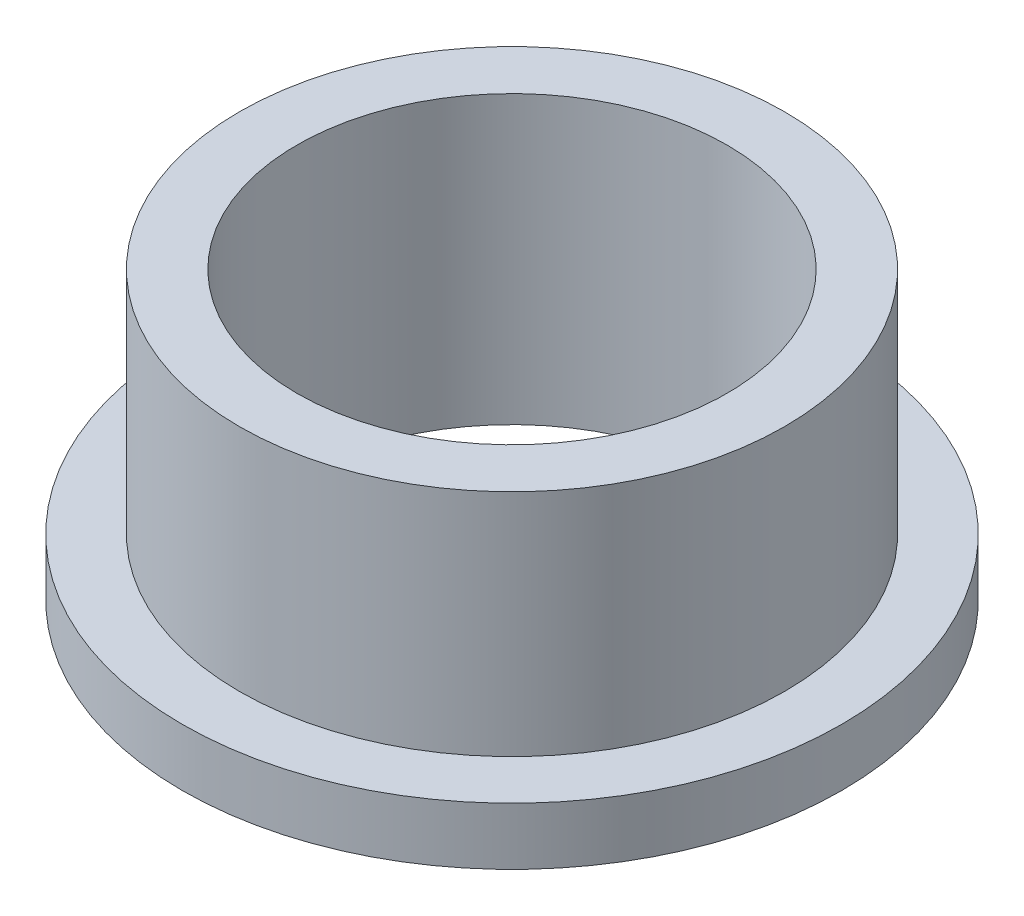
ISO-10303-21;
HEADER;
FILE_DESCRIPTION(('STEP AP214'),'2;1');
FILE_NAME('part.step','',(''),(''),'','','');
FILE_SCHEMA(('AUTOMOTIVE_DESIGN { 1 0 10303 214 1 1 1 1 }'));
ENDSEC;
DATA;
#1=APPLICATION_CONTEXT('core data for automotive mechanical design processes');
#2=APPLICATION_PROTOCOL_DEFINITION('international standard','automotive_design',2000,#1);
#3=PRODUCT_CONTEXT('',#1,'mechanical');
#4=PRODUCT('Part','Part','',(#3));
#5=PRODUCT_RELATED_PRODUCT_CATEGORY('part','',(#4));
#6=PRODUCT_DEFINITION_FORMATION('','',#4);
#7=PRODUCT_DEFINITION_CONTEXT('part definition',#1,'design');
#8=PRODUCT_DEFINITION('design','',#6,#7);
#9=PRODUCT_DEFINITION_SHAPE('','',#8);
#10=(LENGTH_UNIT() NAMED_UNIT(*) SI_UNIT(.MILLI.,.METRE.));
#11=(NAMED_UNIT(*) PLANE_ANGLE_UNIT() SI_UNIT($,.RADIAN.));
#12=(NAMED_UNIT(*) SI_UNIT($,.STERADIAN.) SOLID_ANGLE_UNIT());
#13=UNCERTAINTY_MEASURE_WITH_UNIT(LENGTH_MEASURE(1.E-05),#10,'distance_accuracy_value','');
#14=(GEOMETRIC_REPRESENTATION_CONTEXT(3) GLOBAL_UNCERTAINTY_ASSIGNED_CONTEXT((#13)) GLOBAL_UNIT_ASSIGNED_CONTEXT((#10,
#11,#12)) REPRESENTATION_CONTEXT('',''));
#15=CARTESIAN_POINT('',(0.,0.,0.));
#16=DIRECTION('',(0.,0.,1.));
#17=DIRECTION('',(1.,0.,0.));
#18=AXIS2_PLACEMENT_3D('',#15,#16,#17);
#19=CARTESIAN_POINT('',(0.,20.,0.));
#20=DIRECTION('',(0.,1.,0.));
#21=DIRECTION('',(0.,0.,1.));
#22=AXIS2_PLACEMENT_3D('',#19,#20,#21);
#23=PLANE('',#22);
#24=CARTESIAN_POINT('',(0.,20.,0.));
#25=DIRECTION('',(0.,1.,0.));
#26=DIRECTION('',(0.,0.,1.));
#27=AXIS2_PLACEMENT_3D('',#24,#25,#26);
#28=CIRCLE('',#27,19.02);
#29=CARTESIAN_POINT('',(0.,20.,19.02));
#30=VERTEX_POINT('',#29);
#31=EDGE_CURVE('E10',#30,#30,#28,.T.);
#32=ORIENTED_EDGE('',*,*,#31,.T.);
#33=EDGE_LOOP('',(#32));
#34=FACE_BOUND('',#33,.T.);
#35=CARTESIAN_POINT('',(0.,20.,0.));
#36=DIRECTION('',(0.,1.,0.));
#37=DIRECTION('',(0.,0.,1.));
#38=AXIS2_PLACEMENT_3D('',#35,#36,#37);
#39=CIRCLE('',#38,15.005);
#40=CARTESIAN_POINT('',(0.,20.,15.005));
#41=VERTEX_POINT('',#40);
#42=EDGE_CURVE('E38',#41,#41,#39,.T.);
#43=ORIENTED_EDGE('',*,*,#42,.F.);
#44=EDGE_LOOP('',(#43));
#45=FACE_BOUND('',#44,.T.);
#46=ADVANCED_FACE('F31',(#34,#45),#23,.T.);
#47=CARTESIAN_POINT('',(0.,0.,0.));
#48=DIRECTION('',(0.,1.,0.));
#49=DIRECTION('',(0.,0.,1.));
#50=AXIS2_PLACEMENT_3D('',#47,#48,#49);
#51=PLANE('',#50);
#52=CARTESIAN_POINT('',(0.,0.,0.));
#53=DIRECTION('',(0.,1.,0.));
#54=DIRECTION('',(0.,0.,1.));
#55=AXIS2_PLACEMENT_3D('',#52,#53,#54);
#56=CIRCLE('',#55,15.005);
#57=CARTESIAN_POINT('',(0.,0.,15.005));
#58=VERTEX_POINT('',#57);
#59=EDGE_CURVE('E42',#58,#58,#56,.T.);
#60=ORIENTED_EDGE('',*,*,#59,.T.);
#61=EDGE_LOOP('',(#60));
#62=FACE_BOUND('',#61,.T.);
#63=CARTESIAN_POINT('',(0.,0.,0.));
#64=DIRECTION('',(0.,1.,0.));
#65=DIRECTION('',(0.,0.,1.));
#66=AXIS2_PLACEMENT_3D('',#63,#64,#65);
#67=CIRCLE('',#66,23.);
#68=CARTESIAN_POINT('',(0.,0.,23.));
#69=VERTEX_POINT('',#68);
#70=EDGE_CURVE('E49',#69,#69,#67,.T.);
#71=ORIENTED_EDGE('',*,*,#70,.F.);
#72=EDGE_LOOP('',(#71));
#73=FACE_BOUND('',#72,.T.);
#74=ADVANCED_FACE('F74',(#62,#73),#51,.F.);
#75=CARTESIAN_POINT('',(0.,20.,0.));
#76=DIRECTION('',(0.,-1.,0.));
#77=DIRECTION('',(0.,0.,-1.));
#78=AXIS2_PLACEMENT_3D('',#75,#76,#77);
#79=CYLINDRICAL_SURFACE('',#78,19.02);
#80=CARTESIAN_POINT('',(0.,4.,0.));
#81=DIRECTION('',(0.,1.,0.));
#82=DIRECTION('',(0.,0.,1.));
#83=AXIS2_PLACEMENT_3D('',#80,#81,#82);
#84=CIRCLE('',#83,19.02);
#85=CARTESIAN_POINT('',(0.,4.,19.02));
#86=VERTEX_POINT('',#85);
#87=EDGE_CURVE('E52',#86,#86,#84,.T.);
#88=ORIENTED_EDGE('',*,*,#87,.T.);
#89=EDGE_LOOP('',(#88));
#90=FACE_BOUND('',#89,.T.);
#91=ORIENTED_EDGE('',*,*,#31,.F.);
#92=EDGE_LOOP('',(#91));
#93=FACE_BOUND('',#92,.T.);
#94=ADVANCED_FACE('F33',(#90,#93),#79,.T.);
#95=CARTESIAN_POINT('',(0.,20.,0.));
#96=DIRECTION('',(0.,-1.,0.));
#97=DIRECTION('',(0.,0.,-1.));
#98=AXIS2_PLACEMENT_3D('',#95,#96,#97);
#99=CYLINDRICAL_SURFACE('',#98,15.005);
#100=ORIENTED_EDGE('',*,*,#42,.T.);
#101=EDGE_LOOP('',(#100));
#102=FACE_BOUND('',#101,.T.);
#103=ORIENTED_EDGE('',*,*,#59,.F.);
#104=EDGE_LOOP('',(#103));
#105=FACE_BOUND('',#104,.T.);
#106=ADVANCED_FACE('F63',(#102,#105),#99,.F.);
#107=CARTESIAN_POINT('',(0.,4.,0.));
#108=DIRECTION('',(0.,1.,0.));
#109=DIRECTION('',(0.,0.,1.));
#110=AXIS2_PLACEMENT_3D('',#107,#108,#109);
#111=PLANE('',#110);
#112=CARTESIAN_POINT('',(0.,4.,0.));
#113=DIRECTION('',(0.,1.,0.));
#114=DIRECTION('',(0.,0.,1.));
#115=AXIS2_PLACEMENT_3D('',#112,#113,#114);
#116=CIRCLE('',#115,23.);
#117=CARTESIAN_POINT('',(0.,4.,23.));
#118=VERTEX_POINT('',#117);
#119=EDGE_CURVE('E47',#118,#118,#116,.T.);
#120=ORIENTED_EDGE('',*,*,#119,.T.);
#121=EDGE_LOOP('',(#120));
#122=FACE_BOUND('',#121,.T.);
#123=ORIENTED_EDGE('',*,*,#87,.F.);
#124=EDGE_LOOP('',(#123));
#125=FACE_BOUND('',#124,.T.);
#126=ADVANCED_FACE('F60',(#122,#125),#111,.T.);
#127=CARTESIAN_POINT('',(0.,4.,0.));
#128=DIRECTION('',(0.,-1.,0.));
#129=DIRECTION('',(0.,0.,-1.));
#130=AXIS2_PLACEMENT_3D('',#127,#128,#129);
#131=CYLINDRICAL_SURFACE('',#130,23.);
#132=ORIENTED_EDGE('',*,*,#119,.F.);
#133=EDGE_LOOP('',(#132));
#134=FACE_BOUND('',#133,.T.);
#135=ORIENTED_EDGE('',*,*,#70,.T.);
#136=EDGE_LOOP('',(#135));
#137=FACE_BOUND('',#136,.T.);
#138=ADVANCED_FACE('F62',(#134,#137),#131,.T.);
#139=CLOSED_SHELL('',(#46,#74,#94,#106,#126,#138));
#140=MANIFOLD_SOLID_BREP('B2',#139);
#141=ADVANCED_BREP_SHAPE_REPRESENTATION('',(#18,#140),#14);
#142=SHAPE_DEFINITION_REPRESENTATION(#9,#141);
ENDSEC;
END-ISO-10303-21;
